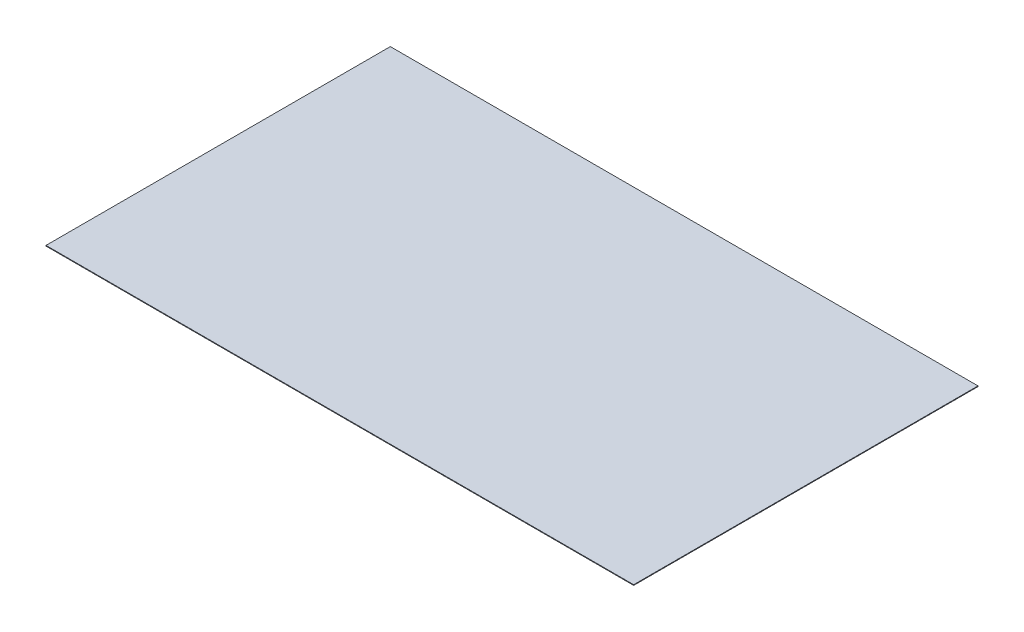
ISO-10303-21;
HEADER;
FILE_DESCRIPTION(('STEP AP214'),'2;1');
FILE_NAME('part.step','',(''),(''),'','','');
FILE_SCHEMA(('AUTOMOTIVE_DESIGN { 1 0 10303 214 1 1 1 1 }'));
ENDSEC;
DATA;
#1=APPLICATION_CONTEXT('core data for automotive mechanical design processes');
#2=APPLICATION_PROTOCOL_DEFINITION('international standard','automotive_design',2000,#1);
#3=PRODUCT_CONTEXT('',#1,'mechanical');
#4=PRODUCT('Part','Part','',(#3));
#5=PRODUCT_RELATED_PRODUCT_CATEGORY('part','',(#4));
#6=PRODUCT_DEFINITION_FORMATION('','',#4);
#7=PRODUCT_DEFINITION_CONTEXT('part definition',#1,'design');
#8=PRODUCT_DEFINITION('design','',#6,#7);
#9=PRODUCT_DEFINITION_SHAPE('','',#8);
#10=(LENGTH_UNIT() NAMED_UNIT(*) SI_UNIT(.MILLI.,.METRE.));
#11=(NAMED_UNIT(*) PLANE_ANGLE_UNIT() SI_UNIT($,.RADIAN.));
#12=(NAMED_UNIT(*) SI_UNIT($,.STERADIAN.) SOLID_ANGLE_UNIT());
#13=UNCERTAINTY_MEASURE_WITH_UNIT(LENGTH_MEASURE(1.E-05),#10,'distance_accuracy_value','');
#14=(GEOMETRIC_REPRESENTATION_CONTEXT(3) GLOBAL_UNCERTAINTY_ASSIGNED_CONTEXT((#13)) GLOBAL_UNIT_ASSIGNED_CONTEXT((#10,
#11,#12)) REPRESENTATION_CONTEXT('',''));
#15=CARTESIAN_POINT('',(0.,0.,0.));
#16=DIRECTION('',(0.,0.,1.));
#17=DIRECTION('',(1.,0.,0.));
#18=AXIS2_PLACEMENT_3D('',#15,#16,#17);
#19=CARTESIAN_POINT('',(1.5,120.,-818.5));
#20=DIRECTION('',(-1.,0.,0.));
#21=DIRECTION('',(0.,0.,1.));
#22=AXIS2_PLACEMENT_3D('',#19,#20,#21);
#23=PLANE('',#22);
#24=DIRECTION('',(0.,-1.,0.));
#25=VECTOR('',#24,1.);
#26=CARTESIAN_POINT('',(1.5,120.,0.));
#27=LINE('',#26,#25);
#28=CARTESIAN_POINT('',(1.5,121.5,0.));
#29=VERTEX_POINT('',#28);
#30=CARTESIAN_POINT('',(1.5,120.,0.));
#31=VERTEX_POINT('',#30);
#32=EDGE_CURVE('E103',#29,#31,#27,.T.);
#33=ORIENTED_EDGE('',*,*,#32,.F.);
#34=DIRECTION('',(0.,0.,1.));
#35=VECTOR('',#34,1.);
#36=CARTESIAN_POINT('',(1.5,121.5,-818.5));
#37=LINE('',#36,#35);
#38=CARTESIAN_POINT('',(1.5,121.5,-818.5));
#39=VERTEX_POINT('',#38);
#40=EDGE_CURVE('E11',#39,#29,#37,.T.);
#41=ORIENTED_EDGE('',*,*,#40,.F.);
#42=DIRECTION('',(0.,-1.,0.));
#43=VECTOR('',#42,1.);
#44=CARTESIAN_POINT('',(1.5,120.,-818.5));
#45=LINE('',#44,#43);
#46=CARTESIAN_POINT('',(1.5,120.,-818.5));
#47=VERTEX_POINT('',#46);
#48=EDGE_CURVE('E97',#39,#47,#45,.T.);
#49=ORIENTED_EDGE('',*,*,#48,.T.);
#50=DIRECTION('',(0.,0.,1.));
#51=VECTOR('',#50,1.);
#52=CARTESIAN_POINT('',(1.5,120.,-818.5));
#53=LINE('',#52,#51);
#54=EDGE_CURVE('E42',#47,#31,#53,.T.);
#55=ORIENTED_EDGE('',*,*,#54,.T.);
#56=EDGE_LOOP('',(#33,#41,#49,#55));
#57=FACE_BOUND('',#56,.T.);
#58=ADVANCED_FACE('F39',(#57),#23,.T.);
#59=CARTESIAN_POINT('',(1.5,121.5,-818.5));
#60=DIRECTION('',(0.,1.,0.));
#61=DIRECTION('',(0.,0.,1.));
#62=AXIS2_PLACEMENT_3D('',#59,#60,#61);
#63=PLANE('',#62);
#64=DIRECTION('',(-1.,0.,0.));
#65=VECTOR('',#64,1.);
#66=CARTESIAN_POINT('',(1.5,121.5,0.));
#67=LINE('',#66,#65);
#68=CARTESIAN_POINT('',(1398.5,121.5,0.));
#69=VERTEX_POINT('',#68);
#70=EDGE_CURVE('E99',#69,#29,#67,.T.);
#71=ORIENTED_EDGE('',*,*,#70,.F.);
#72=DIRECTION('',(0.,0.,1.));
#73=VECTOR('',#72,1.);
#74=CARTESIAN_POINT('',(1398.5,121.5,-818.5));
#75=LINE('',#74,#73);
#76=CARTESIAN_POINT('',(1398.5,121.5,-818.5));
#77=VERTEX_POINT('',#76);
#78=EDGE_CURVE('E48',#77,#69,#75,.T.);
#79=ORIENTED_EDGE('',*,*,#78,.F.);
#80=DIRECTION('',(-1.,0.,0.));
#81=VECTOR('',#80,1.);
#82=CARTESIAN_POINT('',(1.5,121.5,-818.5));
#83=LINE('',#82,#81);
#84=EDGE_CURVE('E94',#77,#39,#83,.T.);
#85=ORIENTED_EDGE('',*,*,#84,.T.);
#86=ORIENTED_EDGE('',*,*,#40,.T.);
#87=EDGE_LOOP('',(#71,#79,#85,#86));
#88=FACE_BOUND('',#87,.T.);
#89=ADVANCED_FACE('F113',(#88),#63,.T.);
#90=CARTESIAN_POINT('',(1398.5,120.,-818.5));
#91=DIRECTION('',(1.,0.,0.));
#92=DIRECTION('',(0.,0.,-1.));
#93=AXIS2_PLACEMENT_3D('',#90,#91,#92);
#94=PLANE('',#93);
#95=DIRECTION('',(0.,1.,0.));
#96=VECTOR('',#95,1.);
#97=CARTESIAN_POINT('',(1398.5,120.,0.));
#98=LINE('',#97,#96);
#99=CARTESIAN_POINT('',(1398.5,120.,0.));
#100=VERTEX_POINT('',#99);
#101=EDGE_CURVE('E89',#100,#69,#98,.T.);
#102=ORIENTED_EDGE('',*,*,#101,.F.);
#103=DIRECTION('',(0.,0.,1.));
#104=VECTOR('',#103,1.);
#105=CARTESIAN_POINT('',(1398.5,120.,-818.5));
#106=LINE('',#105,#104);
#107=CARTESIAN_POINT('',(1398.5,120.,-818.5));
#108=VERTEX_POINT('',#107);
#109=EDGE_CURVE('E84',#108,#100,#106,.T.);
#110=ORIENTED_EDGE('',*,*,#109,.F.);
#111=DIRECTION('',(0.,1.,0.));
#112=VECTOR('',#111,1.);
#113=CARTESIAN_POINT('',(1398.5,120.,-818.5));
#114=LINE('',#113,#112);
#115=EDGE_CURVE('E87',#108,#77,#114,.T.);
#116=ORIENTED_EDGE('',*,*,#115,.T.);
#117=ORIENTED_EDGE('',*,*,#78,.T.);
#118=EDGE_LOOP('',(#102,#110,#116,#117));
#119=FACE_BOUND('',#118,.T.);
#120=ADVANCED_FACE('F86',(#119),#94,.T.);
#121=CARTESIAN_POINT('',(1.5,120.,-818.5));
#122=DIRECTION('',(0.,-1.,0.));
#123=DIRECTION('',(0.,0.,-1.));
#124=AXIS2_PLACEMENT_3D('',#121,#122,#123);
#125=PLANE('',#124);
#126=DIRECTION('',(1.,0.,0.));
#127=VECTOR('',#126,1.);
#128=CARTESIAN_POINT('',(1.5,120.,0.));
#129=LINE('',#128,#127);
#130=EDGE_CURVE('E106',#31,#100,#129,.T.);
#131=ORIENTED_EDGE('',*,*,#130,.F.);
#132=ORIENTED_EDGE('',*,*,#54,.F.);
#133=DIRECTION('',(1.,0.,0.));
#134=VECTOR('',#133,1.);
#135=CARTESIAN_POINT('',(1.5,120.,-818.5));
#136=LINE('',#135,#134);
#137=EDGE_CURVE('E93',#47,#108,#136,.T.);
#138=ORIENTED_EDGE('',*,*,#137,.T.);
#139=ORIENTED_EDGE('',*,*,#109,.T.);
#140=EDGE_LOOP('',(#131,#132,#138,#139));
#141=FACE_BOUND('',#140,.T.);
#142=ADVANCED_FACE('F96',(#141),#125,.T.);
#143=CARTESIAN_POINT('',(0.,0.,-818.5));
#144=DIRECTION('',(0.,0.,-1.));
#145=DIRECTION('',(-1.,0.,0.));
#146=AXIS2_PLACEMENT_3D('',#143,#144,#145);
#147=PLANE('',#146);
#148=ORIENTED_EDGE('',*,*,#48,.F.);
#149=ORIENTED_EDGE('',*,*,#84,.F.);
#150=ORIENTED_EDGE('',*,*,#115,.F.);
#151=ORIENTED_EDGE('',*,*,#137,.F.);
#152=EDGE_LOOP('',(#148,#149,#150,#151));
#153=FACE_BOUND('',#152,.T.);
#154=ADVANCED_FACE('F92',(#153),#147,.T.);
#155=CARTESIAN_POINT('',(0.,0.,0.));
#156=DIRECTION('',(0.,0.,-1.));
#157=DIRECTION('',(-1.,0.,0.));
#158=AXIS2_PLACEMENT_3D('',#155,#156,#157);
#159=PLANE('',#158);
#160=ORIENTED_EDGE('',*,*,#32,.T.);
#161=ORIENTED_EDGE('',*,*,#130,.T.);
#162=ORIENTED_EDGE('',*,*,#101,.T.);
#163=ORIENTED_EDGE('',*,*,#70,.T.);
#164=EDGE_LOOP('',(#160,#161,#162,#163));
#165=FACE_BOUND('',#164,.T.);
#166=ADVANCED_FACE('F112',(#165),#159,.F.);
#167=CLOSED_SHELL('',(#58,#89,#120,#142,#154,#166));
#168=MANIFOLD_SOLID_BREP('B2',#167);
#169=ADVANCED_BREP_SHAPE_REPRESENTATION('',(#18,#168),#14);
#170=SHAPE_DEFINITION_REPRESENTATION(#9,#169);
ENDSEC;
END-ISO-10303-21;
